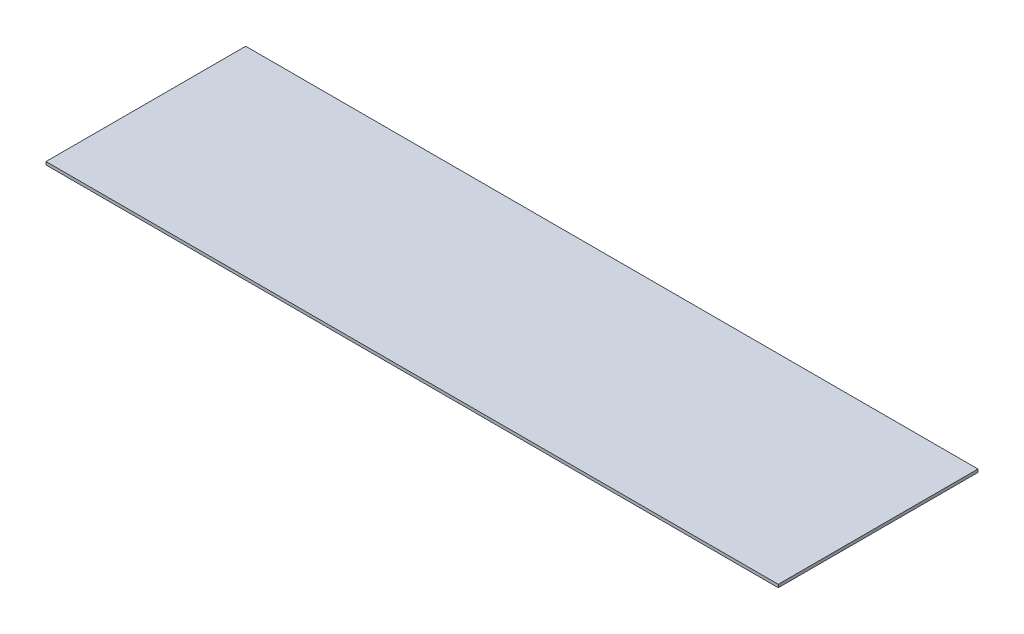
ISO-10303-21;
HEADER;
FILE_DESCRIPTION(('STEP AP214'),'2;1');
FILE_NAME('part.step','',(''),(''),'','','');
FILE_SCHEMA(('AUTOMOTIVE_DESIGN { 1 0 10303 214 1 1 1 1 }'));
ENDSEC;
DATA;
#1=APPLICATION_CONTEXT('core data for automotive mechanical design processes');
#2=APPLICATION_PROTOCOL_DEFINITION('international standard','automotive_design',2000,#1);
#3=PRODUCT_CONTEXT('',#1,'mechanical');
#4=PRODUCT('Part','Part','',(#3));
#5=PRODUCT_RELATED_PRODUCT_CATEGORY('part','',(#4));
#6=PRODUCT_DEFINITION_FORMATION('','',#4);
#7=PRODUCT_DEFINITION_CONTEXT('part definition',#1,'design');
#8=PRODUCT_DEFINITION('design','',#6,#7);
#9=PRODUCT_DEFINITION_SHAPE('','',#8);
#10=(LENGTH_UNIT() NAMED_UNIT(*) SI_UNIT(.MILLI.,.METRE.));
#11=(NAMED_UNIT(*) PLANE_ANGLE_UNIT() SI_UNIT($,.RADIAN.));
#12=(NAMED_UNIT(*) SI_UNIT($,.STERADIAN.) SOLID_ANGLE_UNIT());
#13=UNCERTAINTY_MEASURE_WITH_UNIT(LENGTH_MEASURE(1.E-05),#10,'distance_accuracy_value','');
#14=(GEOMETRIC_REPRESENTATION_CONTEXT(3) GLOBAL_UNCERTAINTY_ASSIGNED_CONTEXT((#13)) GLOBAL_UNIT_ASSIGNED_CONTEXT((#10,
#11,#12)) REPRESENTATION_CONTEXT('',''));
#15=CARTESIAN_POINT('',(0.,0.,0.));
#16=DIRECTION('',(0.,0.,1.));
#17=DIRECTION('',(1.,0.,0.));
#18=AXIS2_PLACEMENT_3D('',#15,#16,#17);
#19=CARTESIAN_POINT('',(0.,2.27838,0.));
#20=DIRECTION('',(0.,1.,0.));
#21=DIRECTION('',(0.,0.,1.));
#22=AXIS2_PLACEMENT_3D('',#19,#20,#21);
#23=PLANE('',#22);
#24=DIRECTION('',(0.,0.,1.));
#25=VECTOR('',#24,1.);
#26=CARTESIAN_POINT('',(0.,2.27838,-76.2));
#27=LINE('',#26,#25);
#28=CARTESIAN_POINT('',(0.,2.27838,76.2));
#29=VERTEX_POINT('',#28);
#30=CARTESIAN_POINT('',(0.,2.27838,-76.2));
#31=VERTEX_POINT('',#30);
#32=EDGE_CURVE('E68',#29,#31,#27,.F.);
#33=ORIENTED_EDGE('',*,*,#32,.F.);
#34=DIRECTION('',(1.,0.,0.));
#35=VECTOR('',#34,1.);
#36=CARTESIAN_POINT('',(0.,2.27838,76.2));
#37=LINE('',#36,#35);
#38=CARTESIAN_POINT('',(558.8,2.27838,76.2));
#39=VERTEX_POINT('',#38);
#40=EDGE_CURVE('E20',#39,#29,#37,.F.);
#41=ORIENTED_EDGE('',*,*,#40,.F.);
#42=DIRECTION('',(0.,0.,-1.));
#43=VECTOR('',#42,1.);
#44=CARTESIAN_POINT('',(558.8,2.27838,76.2));
#45=LINE('',#44,#43);
#46=CARTESIAN_POINT('',(558.8,2.27838,-76.2));
#47=VERTEX_POINT('',#46);
#48=EDGE_CURVE('E58',#47,#39,#45,.F.);
#49=ORIENTED_EDGE('',*,*,#48,.F.);
#50=DIRECTION('',(-1.,0.,0.));
#51=VECTOR('',#50,1.);
#52=CARTESIAN_POINT('',(558.8,2.27838,-76.2));
#53=LINE('',#52,#51);
#54=EDGE_CURVE('E53',#31,#47,#53,.F.);
#55=ORIENTED_EDGE('',*,*,#54,.F.);
#56=EDGE_LOOP('',(#33,#41,#49,#55));
#57=FACE_BOUND('',#56,.T.);
#58=ADVANCED_FACE('F17',(#57),#23,.T.);
#59=CARTESIAN_POINT('',(0.,0.,76.2));
#60=DIRECTION('',(0.,0.,1.));
#61=DIRECTION('',(1.,0.,0.));
#62=AXIS2_PLACEMENT_3D('',#59,#60,#61);
#63=PLANE('',#62);
#64=DIRECTION('',(0.,1.,0.));
#65=VECTOR('',#64,1.);
#66=CARTESIAN_POINT('',(0.,0.,76.2));
#67=LINE('',#66,#65);
#68=CARTESIAN_POINT('',(0.,0.,76.2));
#69=VERTEX_POINT('',#68);
#70=EDGE_CURVE('E79',#69,#29,#67,.T.);
#71=ORIENTED_EDGE('',*,*,#70,.F.);
#72=DIRECTION('',(1.,0.,0.));
#73=VECTOR('',#72,1.);
#74=CARTESIAN_POINT('',(0.,0.,76.2));
#75=LINE('',#74,#73);
#76=CARTESIAN_POINT('',(558.8,0.,76.2));
#77=VERTEX_POINT('',#76);
#78=EDGE_CURVE('E74',#69,#77,#75,.T.);
#79=ORIENTED_EDGE('',*,*,#78,.T.);
#80=DIRECTION('',(0.,1.,0.));
#81=VECTOR('',#80,1.);
#82=CARTESIAN_POINT('',(558.8,0.,76.2));
#83=LINE('',#82,#81);
#84=EDGE_CURVE('E63',#39,#77,#83,.F.);
#85=ORIENTED_EDGE('',*,*,#84,.F.);
#86=ORIENTED_EDGE('',*,*,#40,.T.);
#87=EDGE_LOOP('',(#71,#79,#85,#86));
#88=FACE_BOUND('',#87,.T.);
#89=ADVANCED_FACE('F73',(#88),#63,.T.);
#90=CARTESIAN_POINT('',(558.8,0.,76.2));
#91=DIRECTION('',(1.,0.,0.));
#92=DIRECTION('',(0.,0.,-1.));
#93=AXIS2_PLACEMENT_3D('',#90,#91,#92);
#94=PLANE('',#93);
#95=ORIENTED_EDGE('',*,*,#84,.T.);
#96=DIRECTION('',(0.,0.,1.));
#97=VECTOR('',#96,1.);
#98=CARTESIAN_POINT('',(558.8,0.,0.));
#99=LINE('',#98,#97);
#100=CARTESIAN_POINT('',(558.8,0.,-76.2));
#101=VERTEX_POINT('',#100);
#102=EDGE_CURVE('E84',#77,#101,#99,.F.);
#103=ORIENTED_EDGE('',*,*,#102,.T.);
#104=DIRECTION('',(0.,1.,0.));
#105=VECTOR('',#104,1.);
#106=CARTESIAN_POINT('',(558.8,0.,-76.2));
#107=LINE('',#106,#105);
#108=EDGE_CURVE('E65',#47,#101,#107,.F.);
#109=ORIENTED_EDGE('',*,*,#108,.F.);
#110=ORIENTED_EDGE('',*,*,#48,.T.);
#111=EDGE_LOOP('',(#95,#103,#109,#110));
#112=FACE_BOUND('',#111,.T.);
#113=ADVANCED_FACE('F60',(#112),#94,.T.);
#114=CARTESIAN_POINT('',(558.8,0.,-76.2));
#115=DIRECTION('',(0.,0.,-1.));
#116=DIRECTION('',(-1.,0.,0.));
#117=AXIS2_PLACEMENT_3D('',#114,#115,#116);
#118=PLANE('',#117);
#119=ORIENTED_EDGE('',*,*,#108,.T.);
#120=DIRECTION('',(1.,0.,0.));
#121=VECTOR('',#120,1.);
#122=CARTESIAN_POINT('',(0.,0.,-76.2));
#123=LINE('',#122,#121);
#124=CARTESIAN_POINT('',(0.,0.,-76.2));
#125=VERTEX_POINT('',#124);
#126=EDGE_CURVE('E26',#101,#125,#123,.F.);
#127=ORIENTED_EDGE('',*,*,#126,.T.);
#128=DIRECTION('',(0.,1.,0.));
#129=VECTOR('',#128,1.);
#130=CARTESIAN_POINT('',(0.,0.,-76.2));
#131=LINE('',#130,#129);
#132=EDGE_CURVE('E34',#31,#125,#131,.F.);
#133=ORIENTED_EDGE('',*,*,#132,.F.);
#134=ORIENTED_EDGE('',*,*,#54,.T.);
#135=EDGE_LOOP('',(#119,#127,#133,#134));
#136=FACE_BOUND('',#135,.T.);
#137=ADVANCED_FACE('F88',(#136),#118,.T.);
#138=CARTESIAN_POINT('',(0.,0.,-76.2));
#139=DIRECTION('',(-1.,0.,0.));
#140=DIRECTION('',(0.,0.,1.));
#141=AXIS2_PLACEMENT_3D('',#138,#139,#140);
#142=PLANE('',#141);
#143=ORIENTED_EDGE('',*,*,#132,.T.);
#144=DIRECTION('',(0.,0.,1.));
#145=VECTOR('',#144,1.);
#146=CARTESIAN_POINT('',(0.,0.,0.));
#147=LINE('',#146,#145);
#148=EDGE_CURVE('E11',#125,#69,#147,.T.);
#149=ORIENTED_EDGE('',*,*,#148,.T.);
#150=ORIENTED_EDGE('',*,*,#70,.T.);
#151=ORIENTED_EDGE('',*,*,#32,.T.);
#152=EDGE_LOOP('',(#143,#149,#150,#151));
#153=FACE_BOUND('',#152,.T.);
#154=ADVANCED_FACE('F91',(#153),#142,.T.);
#155=CARTESIAN_POINT('',(0.,0.,0.));
#156=DIRECTION('',(0.,1.,0.));
#157=DIRECTION('',(0.,0.,1.));
#158=AXIS2_PLACEMENT_3D('',#155,#156,#157);
#159=PLANE('',#158);
#160=ORIENTED_EDGE('',*,*,#126,.F.);
#161=ORIENTED_EDGE('',*,*,#102,.F.);
#162=ORIENTED_EDGE('',*,*,#78,.F.);
#163=ORIENTED_EDGE('',*,*,#148,.F.);
#164=EDGE_LOOP('',(#160,#161,#162,#163));
#165=FACE_BOUND('',#164,.T.);
#166=ADVANCED_FACE('F90',(#165),#159,.F.);
#167=CLOSED_SHELL('',(#58,#89,#113,#137,#154,#166));
#168=MANIFOLD_SOLID_BREP('B1',#167);
#169=ADVANCED_BREP_SHAPE_REPRESENTATION('',(#18,#168),#14);
#170=SHAPE_DEFINITION_REPRESENTATION(#9,#169);
ENDSEC;
END-ISO-10303-21;
